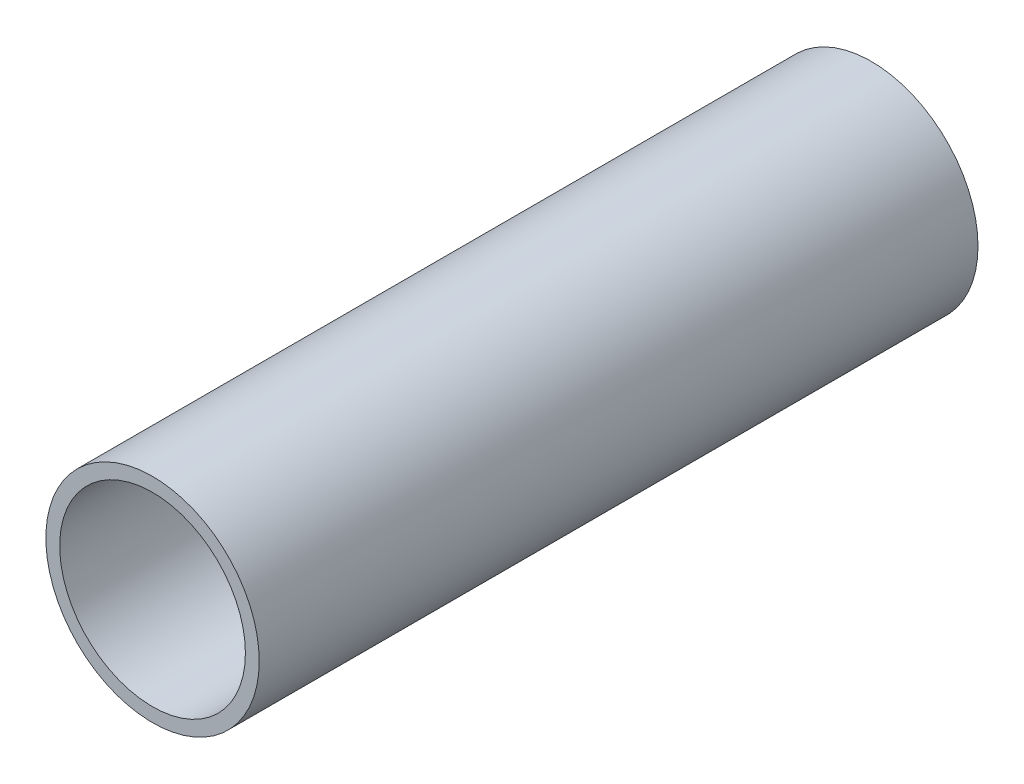
ISO-10303-21;
HEADER;
FILE_DESCRIPTION(('STEP AP214'),'2;1');
FILE_NAME('part.step','',(''),(''),'','','');
FILE_SCHEMA(('AUTOMOTIVE_DESIGN { 1 0 10303 214 1 1 1 1 }'));
ENDSEC;
DATA;
#1=APPLICATION_CONTEXT('core data for automotive mechanical design processes');
#2=APPLICATION_PROTOCOL_DEFINITION('international standard','automotive_design',2000,#1);
#3=PRODUCT_CONTEXT('',#1,'mechanical');
#4=PRODUCT('Part','Part','',(#3));
#5=PRODUCT_RELATED_PRODUCT_CATEGORY('part','',(#4));
#6=PRODUCT_DEFINITION_FORMATION('','',#4);
#7=PRODUCT_DEFINITION_CONTEXT('part definition',#1,'design');
#8=PRODUCT_DEFINITION('design','',#6,#7);
#9=PRODUCT_DEFINITION_SHAPE('','',#8);
#10=(LENGTH_UNIT() NAMED_UNIT(*) SI_UNIT(.MILLI.,.METRE.));
#11=(NAMED_UNIT(*) PLANE_ANGLE_UNIT() SI_UNIT($,.RADIAN.));
#12=(NAMED_UNIT(*) SI_UNIT($,.STERADIAN.) SOLID_ANGLE_UNIT());
#13=UNCERTAINTY_MEASURE_WITH_UNIT(LENGTH_MEASURE(1.E-05),#10,'distance_accuracy_value','');
#14=(GEOMETRIC_REPRESENTATION_CONTEXT(3) GLOBAL_UNCERTAINTY_ASSIGNED_CONTEXT((#13)) GLOBAL_UNIT_ASSIGNED_CONTEXT((#10,
#11,#12)) REPRESENTATION_CONTEXT('',''));
#15=CARTESIAN_POINT('',(0.,0.,0.));
#16=DIRECTION('',(0.,0.,1.));
#17=DIRECTION('',(1.,0.,0.));
#18=AXIS2_PLACEMENT_3D('',#15,#16,#17);
#19=CARTESIAN_POINT('',(0.,0.,101.6));
#20=DIRECTION('',(0.,0.,1.));
#21=DIRECTION('',(1.,0.,0.));
#22=AXIS2_PLACEMENT_3D('',#19,#20,#21);
#23=PLANE('',#22);
#24=CARTESIAN_POINT('',(0.,0.,101.6));
#25=DIRECTION('',(0.,0.,1.));
#26=DIRECTION('',(1.,0.,0.));
#27=AXIS2_PLACEMENT_3D('',#24,#25,#26);
#28=CIRCLE('',#27,30.1625);
#29=CARTESIAN_POINT('',(30.1625,0.,101.6));
#30=VERTEX_POINT('',#29);
#31=EDGE_CURVE('E11',#30,#30,#28,.T.);
#32=ORIENTED_EDGE('',*,*,#31,.T.);
#33=EDGE_LOOP('',(#32));
#34=FACE_BOUND('',#33,.T.);
#35=CARTESIAN_POINT('',(0.,0.,101.6));
#36=DIRECTION('',(0.,0.,1.));
#37=DIRECTION('',(1.,0.,0.));
#38=AXIS2_PLACEMENT_3D('',#35,#36,#37);
#39=CIRCLE('',#38,26.2509);
#40=CARTESIAN_POINT('',(26.2509,0.,101.6));
#41=VERTEX_POINT('',#40);
#42=EDGE_CURVE('E50',#41,#41,#39,.T.);
#43=ORIENTED_EDGE('',*,*,#42,.F.);
#44=EDGE_LOOP('',(#43));
#45=FACE_BOUND('',#44,.T.);
#46=ADVANCED_FACE('F38',(#34,#45),#23,.T.);
#47=CARTESIAN_POINT('',(0.,0.,-101.6));
#48=DIRECTION('',(0.,0.,1.));
#49=DIRECTION('',(1.,0.,0.));
#50=AXIS2_PLACEMENT_3D('',#47,#48,#49);
#51=PLANE('',#50);
#52=CARTESIAN_POINT('',(0.,0.,-101.6));
#53=DIRECTION('',(0.,0.,1.));
#54=DIRECTION('',(1.,0.,0.));
#55=AXIS2_PLACEMENT_3D('',#52,#53,#54);
#56=CIRCLE('',#55,30.1625);
#57=CARTESIAN_POINT('',(30.1625,0.,-101.6));
#58=VERTEX_POINT('',#57);
#59=EDGE_CURVE('E42',#58,#58,#56,.T.);
#60=ORIENTED_EDGE('',*,*,#59,.F.);
#61=EDGE_LOOP('',(#60));
#62=FACE_BOUND('',#61,.T.);
#63=CARTESIAN_POINT('',(0.,0.,-101.6));
#64=DIRECTION('',(0.,0.,1.));
#65=DIRECTION('',(1.,0.,0.));
#66=AXIS2_PLACEMENT_3D('',#63,#64,#65);
#67=CIRCLE('',#66,26.2509);
#68=CARTESIAN_POINT('',(26.2509,0.,-101.6));
#69=VERTEX_POINT('',#68);
#70=EDGE_CURVE('E52',#69,#69,#67,.T.);
#71=ORIENTED_EDGE('',*,*,#70,.T.);
#72=EDGE_LOOP('',(#71));
#73=FACE_BOUND('',#72,.T.);
#74=ADVANCED_FACE('F63',(#62,#73),#51,.F.);
#75=CARTESIAN_POINT('',(0.,0.,101.6));
#76=DIRECTION('',(0.,0.,-1.));
#77=DIRECTION('',(-1.,0.,0.));
#78=AXIS2_PLACEMENT_3D('',#75,#76,#77);
#79=CYLINDRICAL_SURFACE('',#78,30.1625);
#80=ORIENTED_EDGE('',*,*,#31,.F.);
#81=EDGE_LOOP('',(#80));
#82=FACE_BOUND('',#81,.T.);
#83=ORIENTED_EDGE('',*,*,#59,.T.);
#84=EDGE_LOOP('',(#83));
#85=FACE_BOUND('',#84,.T.);
#86=ADVANCED_FACE('F40',(#82,#85),#79,.T.);
#87=CARTESIAN_POINT('',(0.,0.,101.6));
#88=DIRECTION('',(0.,0.,-1.));
#89=DIRECTION('',(-1.,0.,0.));
#90=AXIS2_PLACEMENT_3D('',#87,#88,#89);
#91=CYLINDRICAL_SURFACE('',#90,26.2509);
#92=ORIENTED_EDGE('',*,*,#42,.T.);
#93=EDGE_LOOP('',(#92));
#94=FACE_BOUND('',#93,.T.);
#95=ORIENTED_EDGE('',*,*,#70,.F.);
#96=EDGE_LOOP('',(#95));
#97=FACE_BOUND('',#96,.T.);
#98=ADVANCED_FACE('F59',(#94,#97),#91,.F.);
#99=CLOSED_SHELL('',(#46,#74,#86,#98));
#100=MANIFOLD_SOLID_BREP('B2',#99);
#101=ADVANCED_BREP_SHAPE_REPRESENTATION('',(#18,#100),#14);
#102=SHAPE_DEFINITION_REPRESENTATION(#9,#101);
ENDSEC;
END-ISO-10303-21;
